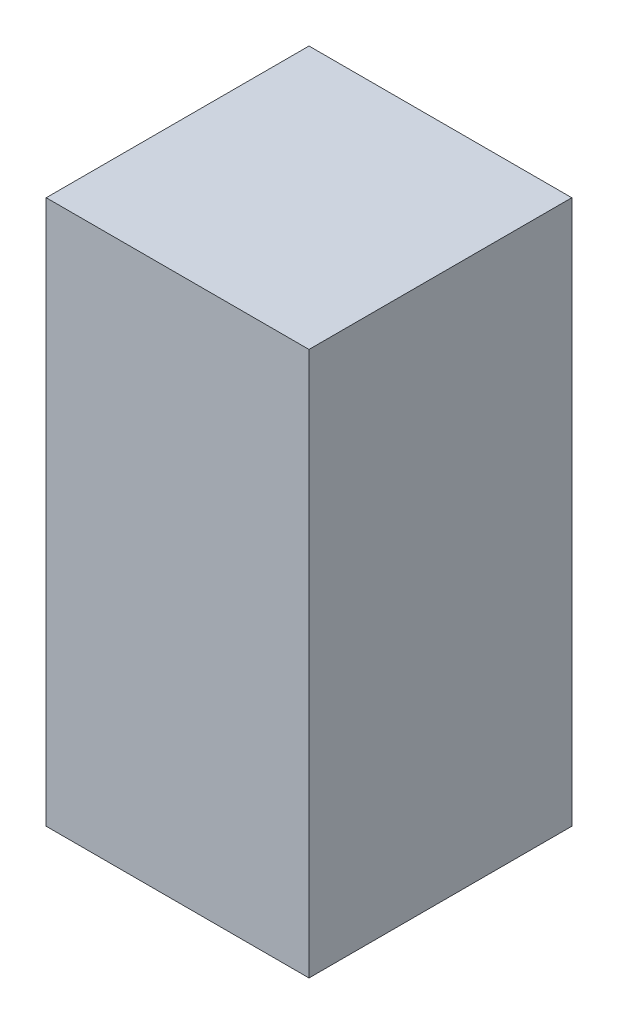
ISO-10303-21;
HEADER;
FILE_DESCRIPTION(('STEP AP214'),'2;1');
FILE_NAME('part.step','',(''),(''),'','','');
FILE_SCHEMA(('AUTOMOTIVE_DESIGN { 1 0 10303 214 1 1 1 1 }'));
ENDSEC;
DATA;
#1=APPLICATION_CONTEXT('core data for automotive mechanical design processes');
#2=APPLICATION_PROTOCOL_DEFINITION('international standard','automotive_design',2000,#1);
#3=PRODUCT_CONTEXT('',#1,'mechanical');
#4=PRODUCT('Part','Part','',(#3));
#5=PRODUCT_RELATED_PRODUCT_CATEGORY('part','',(#4));
#6=PRODUCT_DEFINITION_FORMATION('','',#4);
#7=PRODUCT_DEFINITION_CONTEXT('part definition',#1,'design');
#8=PRODUCT_DEFINITION('design','',#6,#7);
#9=PRODUCT_DEFINITION_SHAPE('','',#8);
#10=(LENGTH_UNIT() NAMED_UNIT(*) SI_UNIT(.MILLI.,.METRE.));
#11=(NAMED_UNIT(*) PLANE_ANGLE_UNIT() SI_UNIT($,.RADIAN.));
#12=(NAMED_UNIT(*) SI_UNIT($,.STERADIAN.) SOLID_ANGLE_UNIT());
#13=UNCERTAINTY_MEASURE_WITH_UNIT(LENGTH_MEASURE(1.E-05),#10,'distance_accuracy_value','');
#14=(GEOMETRIC_REPRESENTATION_CONTEXT(3) GLOBAL_UNCERTAINTY_ASSIGNED_CONTEXT((#13)) GLOBAL_UNIT_ASSIGNED_CONTEXT((#10,
#11,#12)) REPRESENTATION_CONTEXT('',''));
#15=CARTESIAN_POINT('',(0.,0.,0.));
#16=DIRECTION('',(0.,0.,1.));
#17=DIRECTION('',(1.,0.,0.));
#18=AXIS2_PLACEMENT_3D('',#15,#16,#17);
#19=CARTESIAN_POINT('',(0.,-0.86,0.));
#20=DIRECTION('',(0.,1.,0.));
#21=DIRECTION('',(0.,0.,-1.));
#22=AXIS2_PLACEMENT_3D('',#19,#20,#21);
#23=PLANE('',#22);
#24=DIRECTION('',(0.,0.,-1.));
#25=VECTOR('',#24,1.);
#26=CARTESIAN_POINT('',(-0.14,-0.86,0.14));
#27=LINE('',#26,#25);
#28=CARTESIAN_POINT('',(-0.14,-0.86,0.14));
#29=VERTEX_POINT('',#28);
#30=CARTESIAN_POINT('',(-0.14,-0.86,-0.14));
#31=VERTEX_POINT('',#30);
#32=EDGE_CURVE('E89',#29,#31,#27,.T.);
#33=ORIENTED_EDGE('',*,*,#32,.T.);
#34=DIRECTION('',(1.,0.,0.));
#35=VECTOR('',#34,1.);
#36=CARTESIAN_POINT('',(-0.14,-0.86,-0.14));
#37=LINE('',#36,#35);
#38=CARTESIAN_POINT('',(0.14,-0.86,-0.14));
#39=VERTEX_POINT('',#38);
#40=EDGE_CURVE('E109',#31,#39,#37,.T.);
#41=ORIENTED_EDGE('',*,*,#40,.T.);
#42=DIRECTION('',(0.,0.,1.));
#43=VECTOR('',#42,1.);
#44=CARTESIAN_POINT('',(0.14,-0.86,-0.14));
#45=LINE('',#44,#43);
#46=CARTESIAN_POINT('',(0.14,-0.86,0.14));
#47=VERTEX_POINT('',#46);
#48=EDGE_CURVE('E75',#39,#47,#45,.T.);
#49=ORIENTED_EDGE('',*,*,#48,.T.);
#50=DIRECTION('',(-1.,0.,0.));
#51=VECTOR('',#50,1.);
#52=CARTESIAN_POINT('',(0.14,-0.86,0.14));
#53=LINE('',#52,#51);
#54=EDGE_CURVE('E11',#47,#29,#53,.T.);
#55=ORIENTED_EDGE('',*,*,#54,.T.);
#56=EDGE_LOOP('',(#33,#41,#49,#55));
#57=FACE_BOUND('',#56,.T.);
#58=ADVANCED_FACE('F17',(#57),#23,.F.);
#59=CARTESIAN_POINT('',(0.,-0.28,0.));
#60=DIRECTION('',(0.,1.,0.));
#61=DIRECTION('',(0.,0.,-1.));
#62=AXIS2_PLACEMENT_3D('',#59,#60,#61);
#63=PLANE('',#62);
#64=DIRECTION('',(0.,0.,-1.));
#65=VECTOR('',#64,1.);
#66=CARTESIAN_POINT('',(-0.14,-0.28,0.14));
#67=LINE('',#66,#65);
#68=CARTESIAN_POINT('',(-0.14,-0.28,0.14));
#69=VERTEX_POINT('',#68);
#70=CARTESIAN_POINT('',(-0.14,-0.28,-0.14));
#71=VERTEX_POINT('',#70);
#72=EDGE_CURVE('E77',#69,#71,#67,.T.);
#73=ORIENTED_EDGE('',*,*,#72,.F.);
#74=DIRECTION('',(-1.,0.,0.));
#75=VECTOR('',#74,1.);
#76=CARTESIAN_POINT('',(0.14,-0.28,0.14));
#77=LINE('',#76,#75);
#78=CARTESIAN_POINT('',(0.14,-0.28,0.14));
#79=VERTEX_POINT('',#78);
#80=EDGE_CURVE('E21',#79,#69,#77,.T.);
#81=ORIENTED_EDGE('',*,*,#80,.F.);
#82=DIRECTION('',(0.,0.,1.));
#83=VECTOR('',#82,1.);
#84=CARTESIAN_POINT('',(0.14,-0.28,-0.14));
#85=LINE('',#84,#83);
#86=CARTESIAN_POINT('',(0.14,-0.28,-0.14));
#87=VERTEX_POINT('',#86);
#88=EDGE_CURVE('E98',#87,#79,#85,.T.);
#89=ORIENTED_EDGE('',*,*,#88,.F.);
#90=DIRECTION('',(1.,0.,0.));
#91=VECTOR('',#90,1.);
#92=CARTESIAN_POINT('',(-0.14,-0.28,-0.14));
#93=LINE('',#92,#91);
#94=EDGE_CURVE('E79',#71,#87,#93,.T.);
#95=ORIENTED_EDGE('',*,*,#94,.F.);
#96=EDGE_LOOP('',(#73,#81,#89,#95));
#97=FACE_BOUND('',#96,.T.);
#98=ADVANCED_FACE('F19',(#97),#63,.T.);
#99=CARTESIAN_POINT('',(0.14,-0.28,0.14));
#100=DIRECTION('',(0.,0.,-1.));
#101=DIRECTION('',(0.,-1.,0.));
#102=AXIS2_PLACEMENT_3D('',#99,#100,#101);
#103=PLANE('',#102);
#104=DIRECTION('',(0.,-1.,0.));
#105=VECTOR('',#104,1.);
#106=CARTESIAN_POINT('',(0.14,-0.28,0.14));
#107=LINE('',#106,#105);
#108=EDGE_CURVE('E72',#79,#47,#107,.T.);
#109=ORIENTED_EDGE('',*,*,#108,.F.);
#110=ORIENTED_EDGE('',*,*,#80,.T.);
#111=DIRECTION('',(0.,-1.,0.));
#112=VECTOR('',#111,1.);
#113=CARTESIAN_POINT('',(-0.14,-0.28,0.14));
#114=LINE('',#113,#112);
#115=EDGE_CURVE('E70',#69,#29,#114,.T.);
#116=ORIENTED_EDGE('',*,*,#115,.T.);
#117=ORIENTED_EDGE('',*,*,#54,.F.);
#118=EDGE_LOOP('',(#109,#110,#116,#117));
#119=FACE_BOUND('',#118,.T.);
#120=ADVANCED_FACE('F68',(#119),#103,.F.);
#121=CARTESIAN_POINT('',(0.14,-0.28,-0.14));
#122=DIRECTION('',(-1.,0.,0.));
#123=DIRECTION('',(0.,0.,1.));
#124=AXIS2_PLACEMENT_3D('',#121,#122,#123);
#125=PLANE('',#124);
#126=DIRECTION('',(0.,-1.,0.));
#127=VECTOR('',#126,1.);
#128=CARTESIAN_POINT('',(0.14,-0.28,-0.14));
#129=LINE('',#128,#127);
#130=EDGE_CURVE('E105',#87,#39,#129,.T.);
#131=ORIENTED_EDGE('',*,*,#130,.F.);
#132=ORIENTED_EDGE('',*,*,#88,.T.);
#133=ORIENTED_EDGE('',*,*,#108,.T.);
#134=ORIENTED_EDGE('',*,*,#48,.F.);
#135=EDGE_LOOP('',(#131,#132,#133,#134));
#136=FACE_BOUND('',#135,.T.);
#137=ADVANCED_FACE('F119',(#136),#125,.F.);
#138=CARTESIAN_POINT('',(-0.14,-0.28,-0.14));
#139=DIRECTION('',(0.,0.,1.));
#140=DIRECTION('',(0.,-1.,0.));
#141=AXIS2_PLACEMENT_3D('',#138,#139,#140);
#142=PLANE('',#141);
#143=DIRECTION('',(0.,-1.,0.));
#144=VECTOR('',#143,1.);
#145=CARTESIAN_POINT('',(-0.14,-0.28,-0.14));
#146=LINE('',#145,#144);
#147=EDGE_CURVE('E84',#71,#31,#146,.T.);
#148=ORIENTED_EDGE('',*,*,#147,.F.);
#149=ORIENTED_EDGE('',*,*,#94,.T.);
#150=ORIENTED_EDGE('',*,*,#130,.T.);
#151=ORIENTED_EDGE('',*,*,#40,.F.);
#152=EDGE_LOOP('',(#148,#149,#150,#151));
#153=FACE_BOUND('',#152,.T.);
#154=ADVANCED_FACE('F117',(#153),#142,.F.);
#155=CARTESIAN_POINT('',(-0.14,-0.28,0.14));
#156=DIRECTION('',(1.,0.,0.));
#157=DIRECTION('',(0.,1.,0.));
#158=AXIS2_PLACEMENT_3D('',#155,#156,#157);
#159=PLANE('',#158);
#160=ORIENTED_EDGE('',*,*,#115,.F.);
#161=ORIENTED_EDGE('',*,*,#72,.T.);
#162=ORIENTED_EDGE('',*,*,#147,.T.);
#163=ORIENTED_EDGE('',*,*,#32,.F.);
#164=EDGE_LOOP('',(#160,#161,#162,#163));
#165=FACE_BOUND('',#164,.T.);
#166=ADVANCED_FACE('F87',(#165),#159,.F.);
#167=CLOSED_SHELL('',(#58,#98,#120,#137,#154,#166));
#168=MANIFOLD_SOLID_BREP('B1',#167);
#169=ADVANCED_BREP_SHAPE_REPRESENTATION('',(#18,#168),#14);
#170=SHAPE_DEFINITION_REPRESENTATION(#9,#169);
ENDSEC;
END-ISO-10303-21;
